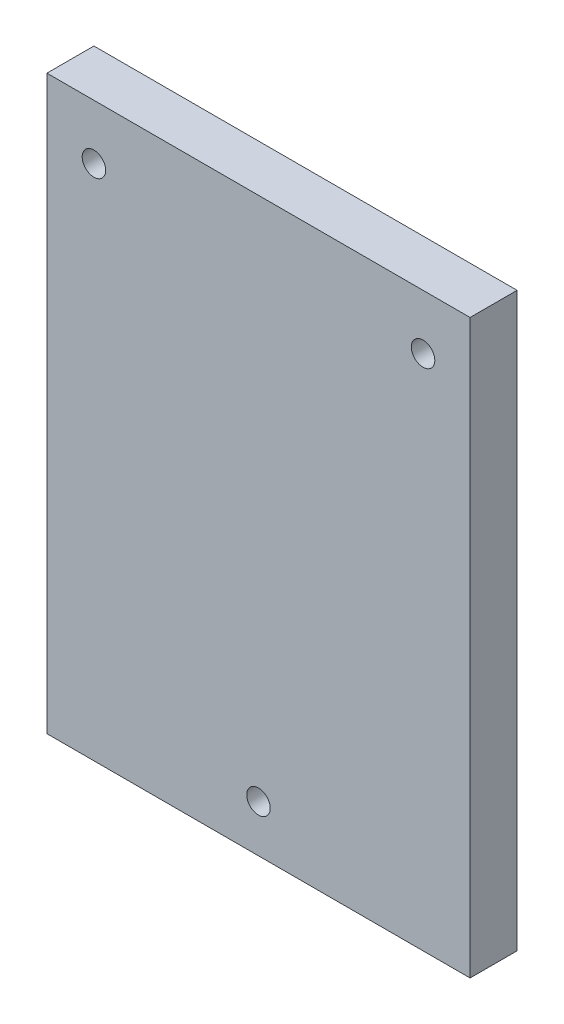
ISO-10303-21;
HEADER;
FILE_DESCRIPTION(('STEP AP214'),'2;1');
FILE_NAME('part.step','',(''),(''),'','','');
FILE_SCHEMA(('AUTOMOTIVE_DESIGN { 1 0 10303 214 1 1 1 1 }'));
ENDSEC;
DATA;
#1=APPLICATION_CONTEXT('core data for automotive mechanical design processes');
#2=APPLICATION_PROTOCOL_DEFINITION('international standard','automotive_design',2000,#1);
#3=PRODUCT_CONTEXT('',#1,'mechanical');
#4=PRODUCT('Part','Part','',(#3));
#5=PRODUCT_RELATED_PRODUCT_CATEGORY('part','',(#4));
#6=PRODUCT_DEFINITION_FORMATION('','',#4);
#7=PRODUCT_DEFINITION_CONTEXT('part definition',#1,'design');
#8=PRODUCT_DEFINITION('design','',#6,#7);
#9=PRODUCT_DEFINITION_SHAPE('','',#8);
#10=(LENGTH_UNIT() NAMED_UNIT(*) SI_UNIT(.MILLI.,.METRE.));
#11=(NAMED_UNIT(*) PLANE_ANGLE_UNIT() SI_UNIT($,.RADIAN.));
#12=(NAMED_UNIT(*) SI_UNIT($,.STERADIAN.) SOLID_ANGLE_UNIT());
#13=UNCERTAINTY_MEASURE_WITH_UNIT(LENGTH_MEASURE(1.E-05),#10,'distance_accuracy_value','');
#14=(GEOMETRIC_REPRESENTATION_CONTEXT(3) GLOBAL_UNCERTAINTY_ASSIGNED_CONTEXT((#13)) GLOBAL_UNIT_ASSIGNED_CONTEXT((#10,
#11,#12)) REPRESENTATION_CONTEXT('',''));
#15=CARTESIAN_POINT('',(0.,0.,0.));
#16=DIRECTION('',(0.,0.,1.));
#17=DIRECTION('',(1.,0.,0.));
#18=AXIS2_PLACEMENT_3D('',#15,#16,#17);
#19=CARTESIAN_POINT('',(0.,0.,6.));
#20=DIRECTION('',(0.,0.,-1.));
#21=DIRECTION('',(-1.,0.,0.));
#22=AXIS2_PLACEMENT_3D('',#19,#20,#21);
#23=PLANE('',#22);
#24=DIRECTION('',(-1.,0.,0.));
#25=VECTOR('',#24,1.);
#26=CARTESIAN_POINT('',(17.275,0.,6.));
#27=LINE('',#26,#25);
#28=CARTESIAN_POINT('',(71.2749999999999,0.,6.));
#29=VERTEX_POINT('',#28);
#30=CARTESIAN_POINT('',(17.275,0.,6.));
#31=VERTEX_POINT('',#30);
#32=EDGE_CURVE('E89',#29,#31,#27,.T.);
#33=ORIENTED_EDGE('',*,*,#32,.T.);
#34=DIRECTION('',(0.,-1.,0.));
#35=VECTOR('',#34,1.);
#36=CARTESIAN_POINT('',(17.275,0.,6.));
#37=LINE('',#36,#35);
#38=CARTESIAN_POINT('',(17.275,-73.,6.));
#39=VERTEX_POINT('',#38);
#40=EDGE_CURVE('E84',#31,#39,#37,.T.);
#41=ORIENTED_EDGE('',*,*,#40,.T.);
#42=DIRECTION('',(1.,0.,0.));
#43=VECTOR('',#42,1.);
#44=CARTESIAN_POINT('',(17.275,-73.,6.));
#45=LINE('',#44,#43);
#46=CARTESIAN_POINT('',(71.2749999999999,-73.,6.));
#47=VERTEX_POINT('',#46);
#48=EDGE_CURVE('E87',#39,#47,#45,.T.);
#49=ORIENTED_EDGE('',*,*,#48,.T.);
#50=DIRECTION('',(0.,1.,0.));
#51=VECTOR('',#50,1.);
#52=CARTESIAN_POINT('',(71.2749999999999,0.,6.));
#53=LINE('',#52,#51);
#54=EDGE_CURVE('E54',#47,#29,#53,.T.);
#55=ORIENTED_EDGE('',*,*,#54,.T.);
#56=EDGE_LOOP('',(#33,#41,#49,#55));
#57=FACE_BOUND('',#56,.T.);
#58=CARTESIAN_POINT('',(44.275,-67.,6.));
#59=DIRECTION('',(0.,0.,1.));
#60=DIRECTION('',(1.,0.,0.));
#61=AXIS2_PLACEMENT_3D('',#58,#59,#60);
#62=CIRCLE('',#61,1.5);
#63=CARTESIAN_POINT('',(45.775,-67.,6.));
#64=VERTEX_POINT('',#63);
#65=EDGE_CURVE('E104',#64,#64,#62,.T.);
#66=ORIENTED_EDGE('',*,*,#65,.F.);
#67=EDGE_LOOP('',(#66));
#68=FACE_BOUND('',#67,.T.);
#69=CARTESIAN_POINT('',(65.2749999999999,-7.00000000000001,6.));
#70=DIRECTION('',(0.,0.,1.));
#71=DIRECTION('',(1.,0.,0.));
#72=AXIS2_PLACEMENT_3D('',#69,#70,#71);
#73=CIRCLE('',#72,1.5);
#74=CARTESIAN_POINT('',(66.7749999999999,-7.00000000000001,6.));
#75=VERTEX_POINT('',#74);
#76=EDGE_CURVE('E119',#75,#75,#73,.T.);
#77=ORIENTED_EDGE('',*,*,#76,.F.);
#78=EDGE_LOOP('',(#77));
#79=FACE_BOUND('',#78,.T.);
#80=CARTESIAN_POINT('',(23.275,-7.,6.));
#81=DIRECTION('',(0.,0.,1.));
#82=DIRECTION('',(1.,0.,0.));
#83=AXIS2_PLACEMENT_3D('',#80,#81,#82);
#84=CIRCLE('',#83,1.5);
#85=CARTESIAN_POINT('',(24.775,-7.,6.));
#86=VERTEX_POINT('',#85);
#87=EDGE_CURVE('E125',#86,#86,#84,.T.);
#88=ORIENTED_EDGE('',*,*,#87,.F.);
#89=EDGE_LOOP('',(#88));
#90=FACE_BOUND('',#89,.T.);
#91=ADVANCED_FACE('F37',(#57,#68,#79,#90),#23,.F.);
#92=CARTESIAN_POINT('',(0.,0.,0.));
#93=DIRECTION('',(0.,0.,-1.));
#94=DIRECTION('',(-1.,0.,0.));
#95=AXIS2_PLACEMENT_3D('',#92,#93,#94);
#96=PLANE('',#95);
#97=CARTESIAN_POINT('',(65.2749999999999,-7.00000000000001,0.));
#98=DIRECTION('',(0.,0.,1.));
#99=DIRECTION('',(1.,0.,0.));
#100=AXIS2_PLACEMENT_3D('',#97,#98,#99);
#101=CIRCLE('',#100,1.5);
#102=CARTESIAN_POINT('',(66.7749999999999,-7.00000000000001,0.));
#103=VERTEX_POINT('',#102);
#104=EDGE_CURVE('E122',#103,#103,#101,.T.);
#105=ORIENTED_EDGE('',*,*,#104,.T.);
#106=EDGE_LOOP('',(#105));
#107=FACE_BOUND('',#106,.T.);
#108=DIRECTION('',(-1.,0.,0.));
#109=VECTOR('',#108,1.);
#110=CARTESIAN_POINT('',(17.275,0.,0.));
#111=LINE('',#110,#109);
#112=CARTESIAN_POINT('',(71.2749999999999,0.,0.));
#113=VERTEX_POINT('',#112);
#114=CARTESIAN_POINT('',(17.275,0.,0.));
#115=VERTEX_POINT('',#114);
#116=EDGE_CURVE('E101',#113,#115,#111,.T.);
#117=ORIENTED_EDGE('',*,*,#116,.F.);
#118=DIRECTION('',(0.,1.,0.));
#119=VECTOR('',#118,1.);
#120=CARTESIAN_POINT('',(71.2749999999999,0.,0.));
#121=LINE('',#120,#119);
#122=CARTESIAN_POINT('',(71.2749999999999,-73.,0.));
#123=VERTEX_POINT('',#122);
#124=EDGE_CURVE('E77',#123,#113,#121,.T.);
#125=ORIENTED_EDGE('',*,*,#124,.F.);
#126=DIRECTION('',(1.,0.,0.));
#127=VECTOR('',#126,1.);
#128=CARTESIAN_POINT('',(17.275,-73.,0.));
#129=LINE('',#128,#127);
#130=CARTESIAN_POINT('',(17.275,-73.,0.));
#131=VERTEX_POINT('',#130);
#132=EDGE_CURVE('E71',#131,#123,#129,.T.);
#133=ORIENTED_EDGE('',*,*,#132,.F.);
#134=DIRECTION('',(0.,-1.,0.));
#135=VECTOR('',#134,1.);
#136=CARTESIAN_POINT('',(17.275,0.,0.));
#137=LINE('',#136,#135);
#138=EDGE_CURVE('E93',#115,#131,#137,.T.);
#139=ORIENTED_EDGE('',*,*,#138,.F.);
#140=EDGE_LOOP('',(#117,#125,#133,#139));
#141=FACE_BOUND('',#140,.T.);
#142=CARTESIAN_POINT('',(44.275,-67.,0.));
#143=DIRECTION('',(0.,0.,1.));
#144=DIRECTION('',(1.,0.,0.));
#145=AXIS2_PLACEMENT_3D('',#142,#143,#144);
#146=CIRCLE('',#145,1.5);
#147=CARTESIAN_POINT('',(45.775,-67.,0.));
#148=VERTEX_POINT('',#147);
#149=EDGE_CURVE('E116',#148,#148,#146,.T.);
#150=ORIENTED_EDGE('',*,*,#149,.T.);
#151=EDGE_LOOP('',(#150));
#152=FACE_BOUND('',#151,.T.);
#153=CARTESIAN_POINT('',(23.275,-7.,0.));
#154=DIRECTION('',(0.,0.,1.));
#155=DIRECTION('',(1.,0.,0.));
#156=AXIS2_PLACEMENT_3D('',#153,#154,#155);
#157=CIRCLE('',#156,1.5);
#158=CARTESIAN_POINT('',(24.775,-7.,0.));
#159=VERTEX_POINT('',#158);
#160=EDGE_CURVE('E128',#159,#159,#157,.T.);
#161=ORIENTED_EDGE('',*,*,#160,.T.);
#162=EDGE_LOOP('',(#161));
#163=FACE_BOUND('',#162,.T.);
#164=ADVANCED_FACE('F112',(#107,#141,#152,#163),#96,.T.);
#165=CARTESIAN_POINT('',(17.275,0.,6.));
#166=DIRECTION('',(0.,-1.,0.));
#167=DIRECTION('',(0.,0.,-1.));
#168=AXIS2_PLACEMENT_3D('',#165,#166,#167);
#169=PLANE('',#168);
#170=ORIENTED_EDGE('',*,*,#116,.T.);
#171=DIRECTION('',(0.,0.,-1.));
#172=VECTOR('',#171,1.);
#173=CARTESIAN_POINT('',(17.275,0.,6.));
#174=LINE('',#173,#172);
#175=EDGE_CURVE('E11',#31,#115,#174,.T.);
#176=ORIENTED_EDGE('',*,*,#175,.F.);
#177=ORIENTED_EDGE('',*,*,#32,.F.);
#178=DIRECTION('',(0.,0.,-1.));
#179=VECTOR('',#178,1.);
#180=CARTESIAN_POINT('',(71.2749999999999,0.,6.));
#181=LINE('',#180,#179);
#182=EDGE_CURVE('E97',#29,#113,#181,.T.);
#183=ORIENTED_EDGE('',*,*,#182,.T.);
#184=EDGE_LOOP('',(#170,#176,#177,#183));
#185=FACE_BOUND('',#184,.T.);
#186=ADVANCED_FACE('F39',(#185),#169,.F.);
#187=CARTESIAN_POINT('',(17.275,0.,6.));
#188=DIRECTION('',(1.,0.,0.));
#189=DIRECTION('',(0.,1.,0.));
#190=AXIS2_PLACEMENT_3D('',#187,#188,#189);
#191=PLANE('',#190);
#192=ORIENTED_EDGE('',*,*,#138,.T.);
#193=DIRECTION('',(0.,0.,-1.));
#194=VECTOR('',#193,1.);
#195=CARTESIAN_POINT('',(17.275,-73.,6.));
#196=LINE('',#195,#194);
#197=EDGE_CURVE('E46',#39,#131,#196,.T.);
#198=ORIENTED_EDGE('',*,*,#197,.F.);
#199=ORIENTED_EDGE('',*,*,#40,.F.);
#200=ORIENTED_EDGE('',*,*,#175,.T.);
#201=EDGE_LOOP('',(#192,#198,#199,#200));
#202=FACE_BOUND('',#201,.T.);
#203=ADVANCED_FACE('F92',(#202),#191,.F.);
#204=CARTESIAN_POINT('',(17.275,-73.,6.));
#205=DIRECTION('',(0.,1.,0.));
#206=DIRECTION('',(0.,0.,1.));
#207=AXIS2_PLACEMENT_3D('',#204,#205,#206);
#208=PLANE('',#207);
#209=ORIENTED_EDGE('',*,*,#132,.T.);
#210=DIRECTION('',(0.,0.,-1.));
#211=VECTOR('',#210,1.);
#212=CARTESIAN_POINT('',(71.2749999999999,-73.,6.));
#213=LINE('',#212,#211);
#214=EDGE_CURVE('E94',#47,#123,#213,.T.);
#215=ORIENTED_EDGE('',*,*,#214,.F.);
#216=ORIENTED_EDGE('',*,*,#48,.F.);
#217=ORIENTED_EDGE('',*,*,#197,.T.);
#218=EDGE_LOOP('',(#209,#215,#216,#217));
#219=FACE_BOUND('',#218,.T.);
#220=ADVANCED_FACE('F95',(#219),#208,.F.);
#221=CARTESIAN_POINT('',(71.2749999999999,0.,6.));
#222=DIRECTION('',(-1.,0.,0.));
#223=DIRECTION('',(0.,0.,1.));
#224=AXIS2_PLACEMENT_3D('',#221,#222,#223);
#225=PLANE('',#224);
#226=ORIENTED_EDGE('',*,*,#124,.T.);
#227=ORIENTED_EDGE('',*,*,#182,.F.);
#228=ORIENTED_EDGE('',*,*,#54,.F.);
#229=ORIENTED_EDGE('',*,*,#214,.T.);
#230=EDGE_LOOP('',(#226,#227,#228,#229));
#231=FACE_BOUND('',#230,.T.);
#232=ADVANCED_FACE('F109',(#231),#225,.F.);
#233=CARTESIAN_POINT('',(44.275,-67.,6.));
#234=DIRECTION('',(0.,0.,-1.));
#235=DIRECTION('',(-1.,0.,0.));
#236=AXIS2_PLACEMENT_3D('',#233,#234,#235);
#237=CYLINDRICAL_SURFACE('',#236,1.5);
#238=ORIENTED_EDGE('',*,*,#65,.T.);
#239=EDGE_LOOP('',(#238));
#240=FACE_BOUND('',#239,.T.);
#241=ORIENTED_EDGE('',*,*,#149,.F.);
#242=EDGE_LOOP('',(#241));
#243=FACE_BOUND('',#242,.T.);
#244=ADVANCED_FACE('F145',(#240,#243),#237,.F.);
#245=CARTESIAN_POINT('',(65.2749999999999,-7.00000000000001,6.));
#246=DIRECTION('',(0.,0.,-1.));
#247=DIRECTION('',(-1.,0.,0.));
#248=AXIS2_PLACEMENT_3D('',#245,#246,#247);
#249=CYLINDRICAL_SURFACE('',#248,1.5);
#250=ORIENTED_EDGE('',*,*,#76,.T.);
#251=EDGE_LOOP('',(#250));
#252=FACE_BOUND('',#251,.T.);
#253=ORIENTED_EDGE('',*,*,#104,.F.);
#254=EDGE_LOOP('',(#253));
#255=FACE_BOUND('',#254,.T.);
#256=ADVANCED_FACE('F193',(#252,#255),#249,.F.);
#257=CARTESIAN_POINT('',(23.275,-7.,6.));
#258=DIRECTION('',(0.,0.,-1.));
#259=DIRECTION('',(-1.,0.,0.));
#260=AXIS2_PLACEMENT_3D('',#257,#258,#259);
#261=CYLINDRICAL_SURFACE('',#260,1.5);
#262=ORIENTED_EDGE('',*,*,#87,.T.);
#263=EDGE_LOOP('',(#262));
#264=FACE_BOUND('',#263,.T.);
#265=ORIENTED_EDGE('',*,*,#160,.F.);
#266=EDGE_LOOP('',(#265));
#267=FACE_BOUND('',#266,.T.);
#268=ADVANCED_FACE('F134',(#264,#267),#261,.F.);
#269=CLOSED_SHELL('',(#91,#164,#186,#203,#220,#232,#244,#256,#268));
#270=MANIFOLD_SOLID_BREP('B2',#269);
#271=ADVANCED_BREP_SHAPE_REPRESENTATION('',(#18,#270),#14);
#272=SHAPE_DEFINITION_REPRESENTATION(#9,#271);
ENDSEC;
END-ISO-10303-21;
